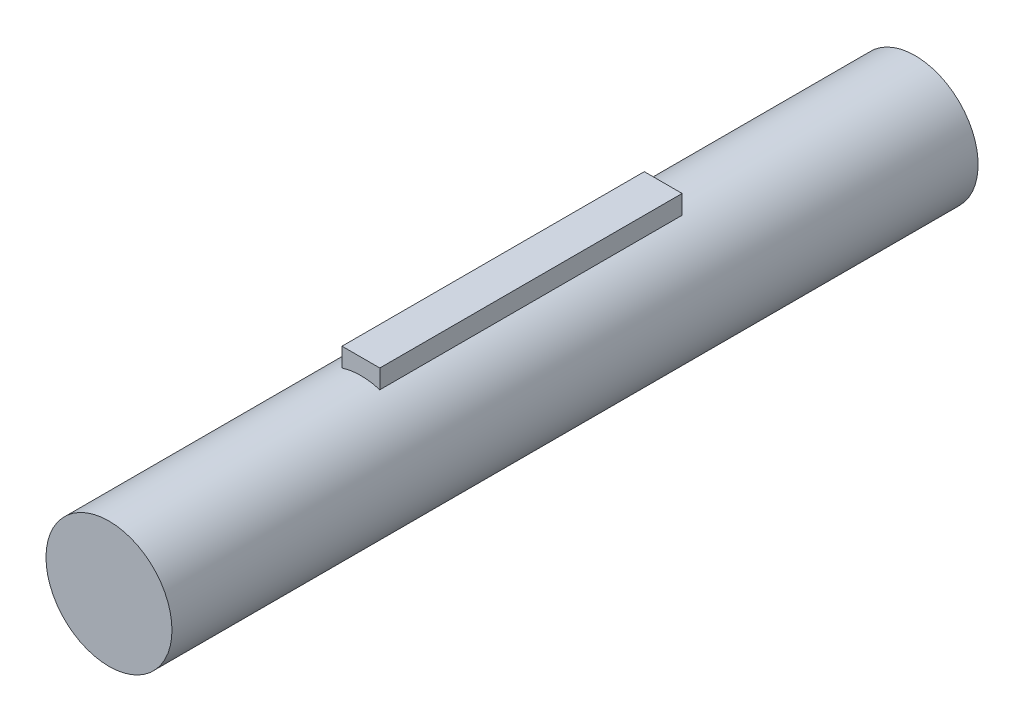
ISO-10303-21;
HEADER;
FILE_DESCRIPTION(('STEP AP214'),'2;1');
FILE_NAME('part.step','',(''),(''),'','','');
FILE_SCHEMA(('AUTOMOTIVE_DESIGN { 1 0 10303 214 1 1 1 1 }'));
ENDSEC;
DATA;
#1=APPLICATION_CONTEXT('core data for automotive mechanical design processes');
#2=APPLICATION_PROTOCOL_DEFINITION('international standard','automotive_design',2000,#1);
#3=PRODUCT_CONTEXT('',#1,'mechanical');
#4=PRODUCT('Part','Part','',(#3));
#5=PRODUCT_RELATED_PRODUCT_CATEGORY('part','',(#4));
#6=PRODUCT_DEFINITION_FORMATION('','',#4);
#7=PRODUCT_DEFINITION_CONTEXT('part definition',#1,'design');
#8=PRODUCT_DEFINITION('design','',#6,#7);
#9=PRODUCT_DEFINITION_SHAPE('','',#8);
#10=(LENGTH_UNIT() NAMED_UNIT(*) SI_UNIT(.MILLI.,.METRE.));
#11=(NAMED_UNIT(*) PLANE_ANGLE_UNIT() SI_UNIT($,.RADIAN.));
#12=(NAMED_UNIT(*) SI_UNIT($,.STERADIAN.) SOLID_ANGLE_UNIT());
#13=UNCERTAINTY_MEASURE_WITH_UNIT(LENGTH_MEASURE(1.E-05),#10,'distance_accuracy_value','');
#14=(GEOMETRIC_REPRESENTATION_CONTEXT(3) GLOBAL_UNCERTAINTY_ASSIGNED_CONTEXT((#13)) GLOBAL_UNIT_ASSIGNED_CONTEXT((#10,
#11,#12)) REPRESENTATION_CONTEXT('',''));
#15=CARTESIAN_POINT('',(0.,0.,0.));
#16=DIRECTION('',(0.,0.,1.));
#17=DIRECTION('',(1.,0.,0.));
#18=AXIS2_PLACEMENT_3D('',#15,#16,#17);
#19=CARTESIAN_POINT('',(0.,0.,0.));
#20=DIRECTION('',(0.,0.,1.));
#21=DIRECTION('',(1.,0.,0.));
#22=AXIS2_PLACEMENT_3D('',#19,#20,#21);
#23=PLANE('',#22);
#24=CARTESIAN_POINT('',(0.,0.,0.));
#25=DIRECTION('',(0.,0.,-1.));
#26=DIRECTION('',(-1.,0.,0.));
#27=AXIS2_PLACEMENT_3D('',#24,#25,#26);
#28=CIRCLE('',#27,7.9375);
#29=CARTESIAN_POINT('',(-2.38125,7.57189241124701,0.));
#30=VERTEX_POINT('',#29);
#31=CARTESIAN_POINT('',(2.38125,7.57189241124701,0.));
#32=VERTEX_POINT('',#31);
#33=EDGE_CURVE('E96',#30,#32,#28,.T.);
#34=ORIENTED_EDGE('',*,*,#33,.F.);
#35=DIRECTION('',(0.,-1.,0.));
#36=VECTOR('',#35,1.);
#37=CARTESIAN_POINT('',(-2.38125,7.57189241124701,0.));
#38=LINE('',#37,#36);
#39=CARTESIAN_POINT('',(-2.38125,9.95314241124701,0.));
#40=VERTEX_POINT('',#39);
#41=EDGE_CURVE('E98',#40,#30,#38,.T.);
#42=ORIENTED_EDGE('',*,*,#41,.F.);
#43=DIRECTION('',(-1.,0.,0.));
#44=VECTOR('',#43,1.);
#45=CARTESIAN_POINT('',(2.38125,9.95314241124701,0.));
#46=LINE('',#45,#44);
#47=CARTESIAN_POINT('',(2.38125,9.95314241124701,0.));
#48=VERTEX_POINT('',#47);
#49=EDGE_CURVE('E83',#48,#40,#46,.T.);
#50=ORIENTED_EDGE('',*,*,#49,.F.);
#51=DIRECTION('',(0.,1.,0.));
#52=VECTOR('',#51,1.);
#53=CARTESIAN_POINT('',(2.38125,7.57189241124701,0.));
#54=LINE('',#53,#52);
#55=EDGE_CURVE('E78',#32,#48,#54,.T.);
#56=ORIENTED_EDGE('',*,*,#55,.F.);
#57=EDGE_LOOP('',(#34,#42,#50,#56));
#58=FACE_BOUND('',#57,.T.);
#59=ADVANCED_FACE('F45',(#58),#23,.F.);
#60=CARTESIAN_POINT('',(-2.38125,7.57189241124701,38.1));
#61=DIRECTION('',(1.,0.,0.));
#62=DIRECTION('',(0.,0.,-1.));
#63=AXIS2_PLACEMENT_3D('',#60,#61,#62);
#64=PLANE('',#63);
#65=ORIENTED_EDGE('',*,*,#41,.T.);
#66=DIRECTION('',(0.,0.,-1.));
#67=VECTOR('',#66,1.);
#68=CARTESIAN_POINT('',(-2.38125,7.57189241124701,38.1));
#69=LINE('',#68,#67);
#70=CARTESIAN_POINT('',(-2.38125,7.57189241124701,38.1));
#71=VERTEX_POINT('',#70);
#72=EDGE_CURVE('E11',#71,#30,#69,.T.);
#73=ORIENTED_EDGE('',*,*,#72,.F.);
#74=DIRECTION('',(0.,-1.,0.));
#75=VECTOR('',#74,1.);
#76=CARTESIAN_POINT('',(-2.38125,7.57189241124701,38.1));
#77=LINE('',#76,#75);
#78=CARTESIAN_POINT('',(-2.38125,9.95314241124701,38.1));
#79=VERTEX_POINT('',#78);
#80=EDGE_CURVE('E87',#79,#71,#77,.T.);
#81=ORIENTED_EDGE('',*,*,#80,.F.);
#82=DIRECTION('',(0.,0.,-1.));
#83=VECTOR('',#82,1.);
#84=CARTESIAN_POINT('',(-2.38125,9.95314241124701,38.1));
#85=LINE('',#84,#83);
#86=EDGE_CURVE('E109',#79,#40,#85,.T.);
#87=ORIENTED_EDGE('',*,*,#86,.T.);
#88=EDGE_LOOP('',(#65,#73,#81,#87));
#89=FACE_BOUND('',#88,.T.);
#90=ADVANCED_FACE('F47',(#89),#64,.F.);
#91=CARTESIAN_POINT('',(0.,0.,38.1));
#92=DIRECTION('',(0.,0.,-1.));
#93=DIRECTION('',(-1.,0.,0.));
#94=AXIS2_PLACEMENT_3D('',#91,#92,#93);
#95=CYLINDRICAL_SURFACE('',#94,7.9375);
#96=ORIENTED_EDGE('',*,*,#72,.T.);
#97=ORIENTED_EDGE('',*,*,#33,.T.);
#98=DIRECTION('',(0.,0.,-1.));
#99=VECTOR('',#98,1.);
#100=CARTESIAN_POINT('',(2.38125,7.57189241124701,38.1));
#101=LINE('',#100,#99);
#102=CARTESIAN_POINT('',(2.38125,7.57189241124701,38.1));
#103=VERTEX_POINT('',#102);
#104=EDGE_CURVE('E55',#103,#32,#101,.T.);
#105=ORIENTED_EDGE('',*,*,#104,.F.);
#106=CARTESIAN_POINT('',(0.,0.,38.1));
#107=DIRECTION('',(0.,0.,1.));
#108=DIRECTION('',(1.,0.,0.));
#109=AXIS2_PLACEMENT_3D('',#106,#107,#108);
#110=CIRCLE('',#109,7.9375);
#111=EDGE_CURVE('E107',#103,#71,#110,.T.);
#112=ORIENTED_EDGE('',*,*,#111,.T.);
#113=EDGE_LOOP('',(#96,#97,#105,#112));
#114=FACE_BOUND('',#113,.T.);
#115=CARTESIAN_POINT('',(0.,0.,69.85));
#116=DIRECTION('',(0.,0.,1.));
#117=DIRECTION('',(1.,0.,0.));
#118=AXIS2_PLACEMENT_3D('',#115,#116,#117);
#119=CIRCLE('',#118,7.9375);
#120=CARTESIAN_POINT('',(7.9375,0.,69.85));
#121=VERTEX_POINT('',#120);
#122=EDGE_CURVE('E111',#121,#121,#119,.T.);
#123=ORIENTED_EDGE('',*,*,#122,.F.);
#124=EDGE_LOOP('',(#123));
#125=FACE_BOUND('',#124,.T.);
#126=CARTESIAN_POINT('',(0.,0.,-31.75));
#127=DIRECTION('',(0.,0.,-1.));
#128=DIRECTION('',(-1.,0.,0.));
#129=AXIS2_PLACEMENT_3D('',#126,#127,#128);
#130=CIRCLE('',#129,7.9375);
#131=CARTESIAN_POINT('',(-7.9375,0.,-31.75));
#132=VERTEX_POINT('',#131);
#133=EDGE_CURVE('E102',#132,#132,#130,.T.);
#134=ORIENTED_EDGE('',*,*,#133,.F.);
#135=EDGE_LOOP('',(#134));
#136=FACE_BOUND('',#135,.T.);
#137=ADVANCED_FACE('F105',(#114,#125,#136),#95,.T.);
#138=CARTESIAN_POINT('',(2.38125,7.57189241124701,38.1));
#139=DIRECTION('',(-1.,0.,0.));
#140=DIRECTION('',(0.,-1.,0.));
#141=AXIS2_PLACEMENT_3D('',#138,#139,#140);
#142=PLANE('',#141);
#143=ORIENTED_EDGE('',*,*,#55,.T.);
#144=DIRECTION('',(0.,0.,-1.));
#145=VECTOR('',#144,1.);
#146=CARTESIAN_POINT('',(2.38125,9.95314241124701,38.1));
#147=LINE('',#146,#145);
#148=CARTESIAN_POINT('',(2.38125,9.95314241124701,38.1));
#149=VERTEX_POINT('',#148);
#150=EDGE_CURVE('E125',#149,#48,#147,.T.);
#151=ORIENTED_EDGE('',*,*,#150,.F.);
#152=DIRECTION('',(0.,1.,0.));
#153=VECTOR('',#152,1.);
#154=CARTESIAN_POINT('',(2.38125,7.57189241124701,38.1));
#155=LINE('',#154,#153);
#156=EDGE_CURVE('E129',#103,#149,#155,.T.);
#157=ORIENTED_EDGE('',*,*,#156,.F.);
#158=ORIENTED_EDGE('',*,*,#104,.T.);
#159=EDGE_LOOP('',(#143,#151,#157,#158));
#160=FACE_BOUND('',#159,.T.);
#161=ADVANCED_FACE('F128',(#160),#142,.F.);
#162=CARTESIAN_POINT('',(2.38125,9.95314241124701,38.1));
#163=DIRECTION('',(0.,-1.,0.));
#164=DIRECTION('',(0.,0.,-1.));
#165=AXIS2_PLACEMENT_3D('',#162,#163,#164);
#166=PLANE('',#165);
#167=ORIENTED_EDGE('',*,*,#49,.T.);
#168=ORIENTED_EDGE('',*,*,#86,.F.);
#169=DIRECTION('',(-1.,0.,0.));
#170=VECTOR('',#169,1.);
#171=CARTESIAN_POINT('',(2.38125,9.95314241124701,38.1));
#172=LINE('',#171,#170);
#173=EDGE_CURVE('E63',#149,#79,#172,.T.);
#174=ORIENTED_EDGE('',*,*,#173,.F.);
#175=ORIENTED_EDGE('',*,*,#150,.T.);
#176=EDGE_LOOP('',(#167,#168,#174,#175));
#177=FACE_BOUND('',#176,.T.);
#178=ADVANCED_FACE('F149',(#177),#166,.F.);
#179=CARTESIAN_POINT('',(0.,0.,38.1));
#180=DIRECTION('',(0.,0.,1.));
#181=DIRECTION('',(1.,0.,0.));
#182=AXIS2_PLACEMENT_3D('',#179,#180,#181);
#183=PLANE('',#182);
#184=ORIENTED_EDGE('',*,*,#111,.F.);
#185=ORIENTED_EDGE('',*,*,#156,.T.);
#186=ORIENTED_EDGE('',*,*,#173,.T.);
#187=ORIENTED_EDGE('',*,*,#80,.T.);
#188=EDGE_LOOP('',(#184,#185,#186,#187));
#189=FACE_BOUND('',#188,.T.);
#190=ADVANCED_FACE('F130',(#189),#183,.T.);
#191=CARTESIAN_POINT('',(0.,0.,69.85));
#192=DIRECTION('',(0.,0.,1.));
#193=DIRECTION('',(1.,0.,0.));
#194=AXIS2_PLACEMENT_3D('',#191,#192,#193);
#195=PLANE('',#194);
#196=ORIENTED_EDGE('',*,*,#122,.T.);
#197=EDGE_LOOP('',(#196));
#198=FACE_BOUND('',#197,.T.);
#199=ADVANCED_FACE('F163',(#198),#195,.T.);
#200=CARTESIAN_POINT('',(0.,0.,-31.75));
#201=DIRECTION('',(0.,0.,-1.));
#202=DIRECTION('',(-1.,0.,0.));
#203=AXIS2_PLACEMENT_3D('',#200,#201,#202);
#204=PLANE('',#203);
#205=ORIENTED_EDGE('',*,*,#133,.T.);
#206=EDGE_LOOP('',(#205));
#207=FACE_BOUND('',#206,.T.);
#208=ADVANCED_FACE('F142',(#207),#204,.T.);
#209=CLOSED_SHELL('',(#59,#90,#137,#161,#178,#190,#199,#208));
#210=MANIFOLD_SOLID_BREP('B2',#209);
#211=ADVANCED_BREP_SHAPE_REPRESENTATION('',(#18,#210),#14);
#212=SHAPE_DEFINITION_REPRESENTATION(#9,#211);
ENDSEC;
END-ISO-10303-21;
